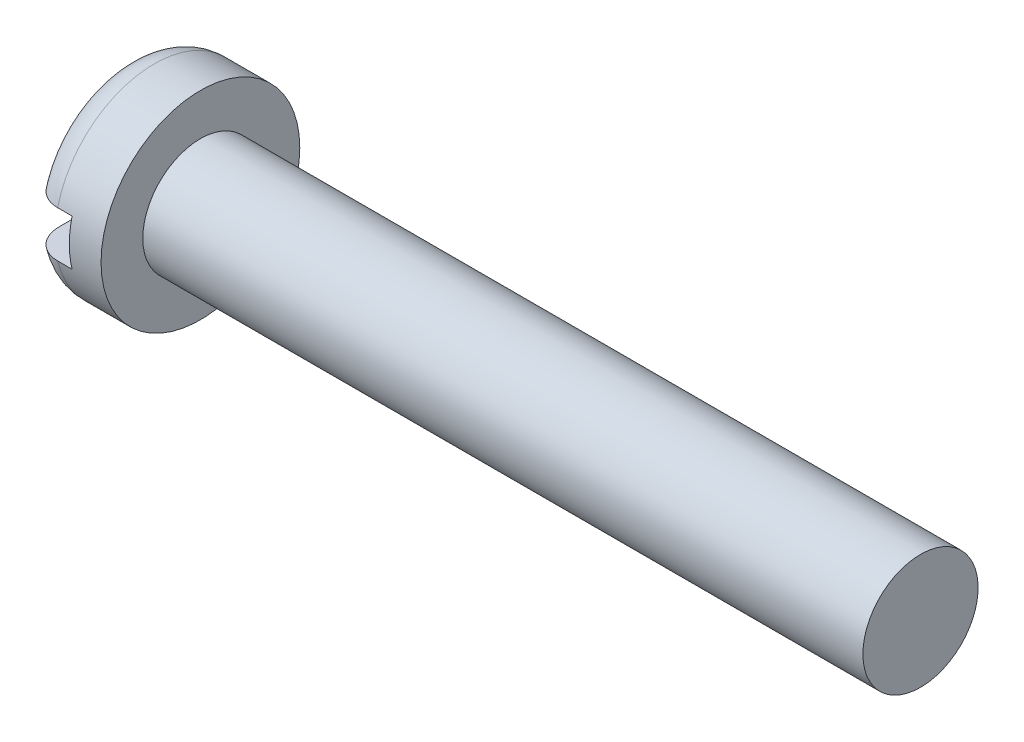
ISO-10303-21;
HEADER;
FILE_DESCRIPTION(('STEP AP214'),'2;1');
FILE_NAME('part.step','',(''),(''),'','','');
FILE_SCHEMA(('AUTOMOTIVE_DESIGN { 1 0 10303 214 1 1 1 1 }'));
ENDSEC;
DATA;
#1=APPLICATION_CONTEXT('core data for automotive mechanical design processes');
#2=APPLICATION_PROTOCOL_DEFINITION('international standard','automotive_design',2000,#1);
#3=PRODUCT_CONTEXT('',#1,'mechanical');
#4=PRODUCT('Part','Part','',(#3));
#5=PRODUCT_RELATED_PRODUCT_CATEGORY('part','',(#4));
#6=PRODUCT_DEFINITION_FORMATION('','',#4);
#7=PRODUCT_DEFINITION_CONTEXT('part definition',#1,'design');
#8=PRODUCT_DEFINITION('design','',#6,#7);
#9=PRODUCT_DEFINITION_SHAPE('','',#8);
#10=(LENGTH_UNIT() NAMED_UNIT(*) SI_UNIT(.MILLI.,.METRE.));
#11=(NAMED_UNIT(*) PLANE_ANGLE_UNIT() SI_UNIT($,.RADIAN.));
#12=(NAMED_UNIT(*) SI_UNIT($,.STERADIAN.) SOLID_ANGLE_UNIT());
#13=UNCERTAINTY_MEASURE_WITH_UNIT(LENGTH_MEASURE(1.E-05),#10,'distance_accuracy_value','');
#14=(GEOMETRIC_REPRESENTATION_CONTEXT(3) GLOBAL_UNCERTAINTY_ASSIGNED_CONTEXT((#13)) GLOBAL_UNIT_ASSIGNED_CONTEXT((#10,
#11,#12)) REPRESENTATION_CONTEXT('',''));
#15=CARTESIAN_POINT('',(0.,0.,0.));
#16=DIRECTION('',(0.,0.,1.));
#17=DIRECTION('',(1.,0.,0.));
#18=AXIS2_PLACEMENT_3D('',#15,#16,#17);
#19=CARTESIAN_POINT('',(0.,0.,0.));
#20=DIRECTION('',(-1.,0.,0.));
#21=DIRECTION('',(0.,0.,1.));
#22=AXIS2_PLACEMENT_3D('',#19,#20,#21);
#23=PLANE('',#22);
#24=DIRECTION('',(0.,0.,-1.));
#25=VECTOR('',#24,1.);
#26=CARTESIAN_POINT('',(0.,0.799999999999999,3.45));
#27=LINE('',#26,#25);
#28=CARTESIAN_POINT('',(0.,0.799999999999999,2.31570723538188));
#29=VERTEX_POINT('',#28);
#30=CARTESIAN_POINT('',(0.,0.799999999999999,-2.31570723538188));
#31=VERTEX_POINT('',#30);
#32=EDGE_CURVE('E191',#29,#31,#27,.T.);
#33=ORIENTED_EDGE('',*,*,#32,.F.);
#34=CARTESIAN_POINT('',(0.,0.,0.));
#35=DIRECTION('',(-1.,0.,0.));
#36=DIRECTION('',(0.,0.,1.));
#37=AXIS2_PLACEMENT_3D('',#34,#35,#36);
#38=CIRCLE('',#37,2.45);
#39=EDGE_CURVE('E108',#29,#31,#38,.T.);
#40=ORIENTED_EDGE('',*,*,#39,.T.);
#41=EDGE_LOOP('',(#33,#40));
#42=FACE_BOUND('',#41,.T.);
#43=ADVANCED_FACE('F32',(#42),#23,.T.);
#44=CARTESIAN_POINT('',(1.,0.,0.));
#45=DIRECTION('',(-1.,0.,0.));
#46=DIRECTION('',(0.,0.,1.));
#47=AXIS2_PLACEMENT_3D('',#44,#45,#46);
#48=TOROIDAL_SURFACE('',#47,2.45,1.);
#49=CARTESIAN_POINT('',(0.379328589562095,0.799999999999999,-3.13356248707986));
#50=CARTESIAN_POINT('',(0.42216324960779,0.799999999999999,-3.16855680472166));
#51=CARTESIAN_POINT('',(0.467921085541035,0.799999999999999,-3.19999606182491));
#52=CARTESIAN_POINT('',(0.564068735088835,0.799999999999999,-3.25478773540702));
#53=CARTESIAN_POINT('',(0.614460287924244,0.799999999999999,-3.27813709961566));
#54=CARTESIAN_POINT('',(0.718487832453669,0.799999999999999,-3.31600908292942));
#55=CARTESIAN_POINT('',(0.772125224869883,0.799999999999999,-3.33052786094909));
#56=CARTESIAN_POINT('',(0.881082475688186,0.799999999999999,-3.35025333735023));
#57=CARTESIAN_POINT('',(0.936402169574521,0.799999999999999,-3.35546094333134));
#58=CARTESIAN_POINT('',(1.04659113389607,0.799999999999999,-3.35639447096481));
#59=CARTESIAN_POINT('',(1.10145966066304,0.799999999999999,-3.35221046648378));
#60=CARTESIAN_POINT('',(1.20971047056224,0.799999999999999,-3.33467925211081));
#61=CARTESIAN_POINT('',(1.26309278448111,0.799999999999999,-3.32133223217636));
#62=CARTESIAN_POINT('',(1.36682394301319,0.799999999999999,-3.28591170963461));
#63=CARTESIAN_POINT('',(1.41717536661802,0.799999999999999,-3.26384575049572));
#64=CARTESIAN_POINT('',(1.51351872065085,0.799999999999999,-3.21167148247726));
#65=CARTESIAN_POINT('',(1.55951050219388,0.799999999999999,-3.18156289907015));
#66=CARTESIAN_POINT('',(1.64645920631654,0.799999999999999,-3.11379971777898));
#67=CARTESIAN_POINT('',(1.6873475732739,0.799999999999999,-3.0760572248481));
#68=CARTESIAN_POINT('',(1.76239453795157,0.799999999999999,-2.9943946044341));
#69=CARTESIAN_POINT('',(1.79655251843696,0.799999999999999,-2.95047391098878));
#70=CARTESIAN_POINT('',(1.85812790428364,0.799999999999999,-2.85653781215608));
#71=CARTESIAN_POINT('',(1.88535255375914,0.799999999999999,-2.80639616146867));
#72=CARTESIAN_POINT('',(1.93134428825464,0.799999999999999,-2.70237970857351));
#73=CARTESIAN_POINT('',(1.95011007040464,0.799999999999999,-2.64850433275524));
#74=CARTESIAN_POINT('',(1.97944609979859,0.799999999999999,-2.5363711092309));
#75=CARTESIAN_POINT('',(1.98967655604326,0.799999999999999,-2.47802448677962));
#76=CARTESIAN_POINT('',(2.00068051693129,0.799999999999999,-2.36045111588208));
#77=CARTESIAN_POINT('',(2.00145193799159,0.799999999999999,-2.30122417640104));
#78=CARTESIAN_POINT('',(1.99355893176028,0.799999999999999,-2.18053140561759));
#79=CARTESIAN_POINT('',(1.98443719354087,0.799999999999999,-2.11909551786252));
#80=CARTESIAN_POINT('',(1.95649088890605,0.799999999999999,-1.99847417027895));
#81=CARTESIAN_POINT('',(1.9376641502528,0.799999999999999,-1.93928921745559));
#82=CARTESIAN_POINT('',(1.88981295630175,0.799999999999999,-1.82192856568864));
#83=CARTESIAN_POINT('',(1.8603510042588,0.799999999999999,-1.76393087932894));
#84=CARTESIAN_POINT('',(1.79221823426723,0.799999999999999,-1.65356232849833));
#85=CARTESIAN_POINT('',(1.75354120166833,0.799999999999999,-1.60119529607969));
#86=CARTESIAN_POINT('',(1.66730460036131,0.799999999999999,-1.50318951482896));
#87=CARTESIAN_POINT('',(1.6196425689982,0.799999999999999,-1.45764049655154));
#88=CARTESIAN_POINT('',(1.51676362996248,0.799999999999999,-1.37607953503427));
#89=CARTESIAN_POINT('',(1.46155776699471,0.799999999999999,-1.34005387111982));
#90=CARTESIAN_POINT('',(1.35888732970495,0.799999999999999,-1.28703254146953));
#91=CARTESIAN_POINT('',(1.31270391560194,0.799999999999999,-1.26754873005201));
#92=CARTESIAN_POINT('',(1.21774303334109,0.799999999999999,-1.23656018278569));
#93=CARTESIAN_POINT('',(1.16896843221444,0.799999999999999,-1.22504681813173));
#94=CARTESIAN_POINT('',(1.06994567718465,0.799999999999999,-1.21078330575391));
#95=CARTESIAN_POINT('',(1.01969260808161,0.799999999999999,-1.20806678518099));
#96=CARTESIAN_POINT('',(0.919513490669943,0.799999999999999,-1.21171856588185));
#97=CARTESIAN_POINT('',(0.869587488348321,0.799999999999999,-1.21808811827695));
#98=CARTESIAN_POINT('',(0.77449815262065,0.799999999999999,-1.23877248185216));
#99=CARTESIAN_POINT('',(0.729226934121978,0.799999999999999,-1.25260173589294));
#100=CARTESIAN_POINT('',(0.64135211056884,0.799999999999999,-1.28703407976989));
#101=CARTESIAN_POINT('',(0.598749362575584,0.799999999999999,-1.30763933277965));
#102=CARTESIAN_POINT('',(0.513214674264477,0.799999999999999,-1.35683304236042));
#103=CARTESIAN_POINT('',(0.47060298426847,0.799999999999999,-1.38597585818542));
#104=CARTESIAN_POINT('',(0.390031559086151,0.799999999999999,-1.45009504787992));
#105=CARTESIAN_POINT('',(0.352074165186173,0.799999999999999,-1.48507433699938));
#106=CARTESIAN_POINT('',(0.275861298540676,0.799999999999999,-1.56565048078707));
#107=CARTESIAN_POINT('',(0.238455542021653,0.799999999999999,-1.612052928849));
#108=CARTESIAN_POINT('',(0.171148936165514,0.799999999999999,-1.71002155397955));
#109=CARTESIAN_POINT('',(0.14125181466106,0.799999999999999,-1.76159027826095));
#110=CARTESIAN_POINT('',(0.0871588933086179,0.799999999999999,-1.87371495190439));
#111=CARTESIAN_POINT('',(0.0637645765654282,0.799999999999999,-1.93465995167718));
#112=CARTESIAN_POINT('',(0.0274753400471483,0.799999999999999,-2.05960853650317));
#113=CARTESIAN_POINT('',(0.0145812367993428,0.799999999999999,-2.12361235900972));
#114=CARTESIAN_POINT('',(-0.000139920877516413,0.799999999999999,-2.25319462705564));
#115=CARTESIAN_POINT('',(-0.00191611196194109,0.799999999999999,-2.31877893346939));
#116=CARTESIAN_POINT('',(0.00610190413474506,0.799999999999999,-2.44925387804717));
#117=CARTESIAN_POINT('',(0.0158950549608111,0.799999999999999,-2.51414457899598));
#118=CARTESIAN_POINT('',(0.0463672287137823,0.799999999999999,-2.6383027763323));
#119=CARTESIAN_POINT('',(0.066549768771832,0.799999999999999,-2.69769207512649));
#120=CARTESIAN_POINT('',(0.117125301866721,0.799999999999999,-2.8119244703886));
#121=CARTESIAN_POINT('',(0.147508585101434,0.799999999999999,-2.86677182854091));
#122=CARTESIAN_POINT('',(0.210006873138939,0.799999999999999,-2.95873579835869));
#123=CARTESIAN_POINT('',(0.240292532419979,0.799999999999999,-2.99710787639285));
#124=CARTESIAN_POINT('',(0.306071544450911,0.799999999999999,-3.06909468248337));
#125=CARTESIAN_POINT('',(0.34156400029591,0.799999999999999,-3.10271022792844));
#126=CARTESIAN_POINT('',(0.379328589562095,0.799999999999999,-3.13356248707986));
#127=B_SPLINE_CURVE_WITH_KNOTS('',3,(#49,#50,#51,#52,#53,#54,#55,#56,#57,#58,#59,#60,#61,#62,
#63,#64,#65,#66,#67,#68,#69,#70,#71,#72,#73,#74,#75,#76,#77,#78,#79,#80,#81,#82,#83,#84,#85,#86,
#87,#88,#89,#90,#91,#92,#93,#94,#95,#96,#97,#98,#99,#100,#101,#102,#103,#104,#105,#106,#107,
#108,#109,#110,#111,#112,#113,#114,#115,#116,#117,#118,#119,#120,#121,#122,#123,#124,#125,#126),
.UNSPECIFIED.,.T.,.F.,(4,2,2,2,2,2,2,2,2,2,2,2,2,2,2,2,2,2,2,2,2,2,2,2,2,2,2,2,2,2,2,2,2,2,2,2,
2,2,4),(0.,0.165765489478357,0.331593453392818,0.497493496859305,0.663377368459352,
0.827677071576171,0.991973368716078,1.15612782982862,1.32028789491814,1.486458306905,
1.65264395107656,1.82304106000352,1.99346440524281,2.17038620048743,2.34734696637007,
2.53285046802217,2.7183955083436,2.9126565938619,3.10704906174605,3.30380950398147,
3.50028490126433,3.65003620847826,3.79962514033556,3.9497852256682,4.09996598952962,
4.24137913009253,4.38283745936037,4.53711911675799,4.69147806799737,4.86954619904787,
5.04770256208482,5.24262745545655,5.43756750531053,5.63339873862761,5.82921209268021,
6.01643391472204,6.20347802843949,6.34964804303276,6.495792908382),.UNSPECIFIED.);
#128=CARTESIAN_POINT('',(1.,0.799999999999999,-3.35596483890997));
#129=VERTEX_POINT('',#128);
#130=EDGE_CURVE('E54',#31,#129,#127,.T.);
#131=ORIENTED_EDGE('',*,*,#130,.F.);
#132=ORIENTED_EDGE('',*,*,#39,.F.);
#133=CARTESIAN_POINT('',(0.950233505543644,0.799999999999999,1.21082409231496));
#134=CARTESIAN_POINT('',(0.999901314950636,0.799999999999999,1.20786305756211));
#135=CARTESIAN_POINT('',(1.04987824434808,0.799999999999999,1.2093586789418));
#136=CARTESIAN_POINT('',(1.14880764745011,0.799999999999999,1.22117214786542));
#137=CARTESIAN_POINT('',(1.19775867448827,0.799999999999999,1.231501693833));
#138=CARTESIAN_POINT('',(1.29297995965792,0.799999999999999,1.26015516016196));
#139=CARTESIAN_POINT('',(1.33926177591377,0.799999999999999,1.27844113356005));
#140=CARTESIAN_POINT('',(1.42841421197942,0.799999999999999,1.32194820657372));
#141=CARTESIAN_POINT('',(1.47128400244018,0.799999999999999,1.34717098569645));
#142=CARTESIAN_POINT('',(1.55611041572956,0.799999999999999,1.40568105316454));
#143=CARTESIAN_POINT('',(1.59773936804486,0.799999999999999,1.43944152385043));
#144=CARTESIAN_POINT('',(1.67566738740522,0.799999999999999,1.51262595568974));
#145=CARTESIAN_POINT('',(1.71196423152633,0.799999999999999,1.55205226542392));
#146=CARTESIAN_POINT('',(1.78371589769894,0.799999999999999,1.64181259231406));
#147=CARTESIAN_POINT('',(1.81823618304841,0.799999999999999,1.69289631704307));
#148=CARTESIAN_POINT('',(1.87886723665165,0.799999999999999,1.79984411915148));
#149=CARTESIAN_POINT('',(1.9049742144087,0.799999999999999,1.85571033690965));
#150=CARTESIAN_POINT('',(1.94956891092814,0.799999999999999,1.9747671239623));
#151=CARTESIAN_POINT('',(1.96742096153191,0.799999999999999,2.03819749670857));
#152=CARTESIAN_POINT('',(1.99206205858004,0.799999999999999,2.1671809246667));
#153=CARTESIAN_POINT('',(1.99885141256574,0.799999999999999,2.23273392081827));
#154=CARTESIAN_POINT('',(2.00086625241663,0.799999999999999,2.36310011941472));
#155=CARTESIAN_POINT('',(1.99625464664842,0.799999999999999,2.42791060187121));
#156=CARTESIAN_POINT('',(1.97563300102092,0.799999999999999,2.55569967532251));
#157=CARTESIAN_POINT('',(1.9596259094081,0.799999999999999,2.61867873575811));
#158=CARTESIAN_POINT('',(1.91750016664232,0.799999999999999,2.7376807746383));
#159=CARTESIAN_POINT('',(1.89191790310337,0.799999999999999,2.79389355251038));
#160=CARTESIAN_POINT('',(1.83120883944759,0.799999999999999,2.90090889450871));
#161=CARTESIAN_POINT('',(1.79608483832818,0.799999999999999,2.95171303914353));
#162=CARTESIAN_POINT('',(1.7191774898602,0.799999999999999,3.04383586072857));
#163=CARTESIAN_POINT('',(1.67780417240582,0.799999999999999,3.0854970721009));
#164=CARTESIAN_POINT('',(1.58842106942357,0.799999999999999,3.16096141536488));
#165=CARTESIAN_POINT('',(1.54041277025886,0.799999999999999,3.19476630268822));
#166=CARTESIAN_POINT('',(1.44101524958936,0.799999999999999,3.2523028967594));
#167=CARTESIAN_POINT('',(1.38981120741904,0.799999999999999,3.27635481760217));
#168=CARTESIAN_POINT('',(1.28403254024917,0.799999999999999,3.31530458741997));
#169=CARTESIAN_POINT('',(1.22945838695094,0.799999999999999,3.33020371429431));
#170=CARTESIAN_POINT('',(1.11975629411733,0.799999999999999,3.35013772682032));
#171=CARTESIAN_POINT('',(1.06466564477981,0.799999999999999,3.35537830490496));
#172=CARTESIAN_POINT('',(0.954393893567213,0.799999999999999,3.35645800959652));
#173=CARTESIAN_POINT('',(0.899212797714537,0.799999999999999,3.35229773862604));
#174=CARTESIAN_POINT('',(0.790765288563437,0.799999999999999,3.33477762522099));
#175=CARTESIAN_POINT('',(0.737487505604657,0.799999999999999,3.32148798575134));
#176=CARTESIAN_POINT('',(0.633901358630035,0.799999999999999,3.28620122173498));
#177=CARTESIAN_POINT('',(0.583593000476652,0.799999999999999,3.26420407999794));
#178=CARTESIAN_POINT('',(0.487045140218185,0.799999999999999,3.21203398802016));
#179=CARTESIAN_POINT('',(0.440830353056087,0.799999999999999,3.18181534171131));
#180=CARTESIAN_POINT('',(0.354013080734486,0.799999999999999,3.11418095298906));
#181=CARTESIAN_POINT('',(0.313410959634569,0.799999999999999,3.07676474408957));
#182=CARTESIAN_POINT('',(0.238125775339669,0.799999999999999,2.99507777500061));
#183=CARTESIAN_POINT('',(0.203568069299999,0.799999999999999,2.95069157240052));
#184=CARTESIAN_POINT('',(0.1421299477148,0.799999999999999,2.85689725717983));
#185=CARTESIAN_POINT('',(0.11525044260639,0.799999999999999,2.80748854996038));
#186=CARTESIAN_POINT('',(0.0689840845975533,0.799999999999999,2.70339255512364));
#187=CARTESIAN_POINT('',(0.0498628329305354,0.799999999999999,2.64858733714804));
#188=CARTESIAN_POINT('',(0.0206693813275202,0.799999999999999,2.53662293773873));
#189=CARTESIAN_POINT('',(0.0105989432620323,0.799999999999999,2.47946330024741));
#190=CARTESIAN_POINT('',(-0.00069953729083651,0.799999999999999,2.36175036962064));
#191=CARTESIAN_POINT('',(-0.00152074357481851,0.799999999999999,2.30115812819215));
#192=CARTESIAN_POINT('',(0.00650996510216422,0.799999999999999,2.1806228761101));
#193=CARTESIAN_POINT('',(0.0153640404941239,0.799999999999999,2.12068001347779));
#194=CARTESIAN_POINT('',(0.0429967206233654,0.799999999999999,1.99995962747682));
#195=CARTESIAN_POINT('',(0.0622502455952226,0.799999999999999,1.93929070195133));
#196=CARTESIAN_POINT('',(0.110306434824482,0.799999999999999,1.82184929217392));
#197=CARTESIAN_POINT('',(0.139112111937843,0.799999999999999,1.76507804412122));
#198=CARTESIAN_POINT('',(0.206724671774443,0.799999999999999,1.65499871478988));
#199=CARTESIAN_POINT('',(0.245852173929219,0.799999999999999,1.6018868964422));
#200=CARTESIAN_POINT('',(0.332732082248245,0.799999999999999,1.50314563953895));
#201=CARTESIAN_POINT('',(0.380490466000798,0.799999999999999,1.45752142881329));
#202=CARTESIAN_POINT('',(0.482142814851046,0.799999999999999,1.37695974759133));
#203=CARTESIAN_POINT('',(0.535824281381173,0.799999999999999,1.34175582122289));
#204=CARTESIAN_POINT('',(0.648993119007128,0.799999999999999,1.28264002496781));
#205=CARTESIAN_POINT('',(0.708458819641164,0.799999999999999,1.25868782892961));
#206=CARTESIAN_POINT('',(0.799170569601131,0.799999999999999,1.23314129702258));
#207=CARTESIAN_POINT('',(0.829026024082726,0.799999999999999,1.22639643463015));
#208=CARTESIAN_POINT('',(0.889293226493369,0.799999999999999,1.21614784200085));
#209=CARTESIAN_POINT('',(0.919704973267781,0.799999999999999,1.21264410503752));
#210=CARTESIAN_POINT('',(0.950233505543644,0.799999999999999,1.21082409231496));
#211=B_SPLINE_CURVE_WITH_KNOTS('',3,(#133,#134,#135,#136,#137,#138,#139,#140,#141,#142,#143,
#144,#145,#146,#147,#148,#149,#150,#151,#152,#153,#154,#155,#156,#157,#158,#159,#160,#161,#162,
#163,#164,#165,#166,#167,#168,#169,#170,#171,#172,#173,#174,#175,#176,#177,#178,#179,#180,#181,
#182,#183,#184,#185,#186,#187,#188,#189,#190,#191,#192,#193,#194,#195,#196,#197,#198,#199,#200,
#201,#202,#203,#204,#205,#206,#207,#208,#209,#210),.UNSPECIFIED.,.T.,.F.,(4,2,2,2,2,2,2,2,2,2,2,
2,2,2,2,2,2,2,2,2,2,2,2,2,2,2,2,2,2,2,2,2,2,2,2,2,2,2,4),(0.,0.149142686358929,
0.298483182962698,0.447119098963346,0.595791033730436,0.755973498316927,0.916222553647615,
1.1003933403799,1.28464698702654,1.48137771881206,1.67810298141907,1.87203352656266,
2.0659139161128,2.25025287753155,2.43453782277558,2.60980395102952,2.78503087976001,
2.95391771310213,3.12278096135646,3.28800452496372,3.45321750106086,3.61717403942373,
3.78113090147095,3.94601835909414,4.11091650695258,4.27890872490592,4.44692085415414,
4.62027856721824,4.7936700195396,4.97465993550509,5.15569027366736,5.34578873207963,
5.53594720680008,5.7329012559948,5.92999223834139,6.12149189523972,6.31229988082678,
6.40397126351722,6.49564245595713),.UNSPECIFIED.);
#212=CARTESIAN_POINT('',(1.,0.799999999999999,3.35596483890997));
#213=VERTEX_POINT('',#212);
#214=EDGE_CURVE('E134',#213,#29,#211,.T.);
#215=ORIENTED_EDGE('',*,*,#214,.F.);
#216=CARTESIAN_POINT('',(1.,0.,0.));
#217=DIRECTION('',(-1.,0.,0.));
#218=DIRECTION('',(0.,0.,1.));
#219=AXIS2_PLACEMENT_3D('',#216,#217,#218);
#220=CIRCLE('',#219,3.45);
#221=EDGE_CURVE('E102',#213,#129,#220,.T.);
#222=ORIENTED_EDGE('',*,*,#221,.T.);
#223=EDGE_LOOP('',(#131,#132,#215,#222));
#224=FACE_BOUND('',#223,.T.);
#225=ADVANCED_FACE('F176',(#224),#48,.T.);
#226=CARTESIAN_POINT('',(-25.4,0.,0.));
#227=DIRECTION('',(-1.,0.,0.));
#228=DIRECTION('',(0.,0.,1.));
#229=AXIS2_PLACEMENT_3D('',#226,#227,#228);
#230=CYLINDRICAL_SURFACE('',#229,2.);
#231=CARTESIAN_POINT('',(27.6,0.,0.));
#232=DIRECTION('',(-1.,0.,0.));
#233=DIRECTION('',(0.,0.,1.));
#234=AXIS2_PLACEMENT_3D('',#231,#232,#233);
#235=CIRCLE('',#234,2.);
#236=CARTESIAN_POINT('',(27.6,0.,2.));
#237=VERTEX_POINT('',#236);
#238=EDGE_CURVE('E116',#237,#237,#235,.T.);
#239=ORIENTED_EDGE('',*,*,#238,.T.);
#240=EDGE_LOOP('',(#239));
#241=FACE_BOUND('',#240,.T.);
#242=CARTESIAN_POINT('',(2.6,0.,0.));
#243=DIRECTION('',(-1.,0.,0.));
#244=DIRECTION('',(0.,0.,1.));
#245=AXIS2_PLACEMENT_3D('',#242,#243,#244);
#246=CIRCLE('',#245,2.);
#247=CARTESIAN_POINT('',(2.6,0.,2.));
#248=VERTEX_POINT('',#247);
#249=EDGE_CURVE('E164',#248,#248,#246,.T.);
#250=ORIENTED_EDGE('',*,*,#249,.F.);
#251=EDGE_LOOP('',(#250));
#252=FACE_BOUND('',#251,.T.);
#253=ADVANCED_FACE('F34',(#241,#252),#230,.T.);
#254=CARTESIAN_POINT('',(27.6,2.,0.));
#255=DIRECTION('',(1.,0.,0.));
#256=DIRECTION('',(0.,0.,-1.));
#257=AXIS2_PLACEMENT_3D('',#254,#255,#256);
#258=PLANE('',#257);
#259=ORIENTED_EDGE('',*,*,#238,.F.);
#260=EDGE_LOOP('',(#259));
#261=FACE_BOUND('',#260,.T.);
#262=ADVANCED_FACE('F184',(#261),#258,.T.);
#263=DIRECTION('',(0.,0.,1.));
#264=VECTOR('',#263,1.);
#265=CARTESIAN_POINT('',(0.,-0.8,-3.45));
#266=LINE('',#265,#264);
#267=CARTESIAN_POINT('',(0.,-0.8,-2.31570723538188));
#268=VERTEX_POINT('',#267);
#269=CARTESIAN_POINT('',(0.,-0.8,2.31570723538188));
#270=VERTEX_POINT('',#269);
#271=EDGE_CURVE('E96',#268,#270,#266,.T.);
#272=ORIENTED_EDGE('',*,*,#271,.F.);
#273=EDGE_CURVE('E104',#268,#270,#38,.T.);
#274=ORIENTED_EDGE('',*,*,#273,.T.);
#275=EDGE_LOOP('',(#272,#274));
#276=FACE_BOUND('',#275,.T.);
#277=ADVANCED_FACE('F178',(#276),#23,.T.);
#278=CARTESIAN_POINT('',(0.379328589562095,-0.8,-3.13356248707986));
#279=CARTESIAN_POINT('',(0.334713816091988,-0.8,-3.09710916791241));
#280=CARTESIAN_POINT('',(0.293233096406716,-0.8,-3.05676770225712));
#281=CARTESIAN_POINT('',(0.217692053331874,-0.8,-2.9696108395322));
#282=CARTESIAN_POINT('',(0.183639619775848,-0.8,-2.92278864447759));
#283=CARTESIAN_POINT('',(0.123866705436374,-0.8,-2.82422532720656));
#284=CARTESIAN_POINT('',(0.0981306975683999,-0.8,-2.77249360773282));
#285=CARTESIAN_POINT('',(0.0554279081805355,-0.8,-2.66555282631215));
#286=CARTESIAN_POINT('',(0.0384599083023377,-0.8,-2.61034424868868));
#287=CARTESIAN_POINT('',(0.0131355135841197,-0.8,-2.4962214414734));
#288=CARTESIAN_POINT('',(0.00505775471622187,-0.8,-2.43724554037945));
#289=CARTESIAN_POINT('',(-0.00157786246153982,-0.8,-2.31876333702174));
#290=CARTESIAN_POINT('',(-0.000133344864085279,-0.8,-2.2592569060842));
#291=CARTESIAN_POINT('',(0.0123150136839031,-0.8,-2.13829391531904));
#292=CARTESIAN_POINT('',(0.023785548247956,-0.8,-2.07688539954483));
#293=CARTESIAN_POINT('',(0.0564098626909815,-0.8,-1.95669722390086));
#294=CARTESIAN_POINT('',(0.0775659478743232,-0.8,-1.89791819354575));
#295=CARTESIAN_POINT('',(0.130085377459132,-0.8,-1.78187727759876));
#296=CARTESIAN_POINT('',(0.161867251843858,-0.8,-1.72480437174009));
#297=CARTESIAN_POINT('',(0.234528164215489,-0.8,-1.61670729137654));
#298=CARTESIAN_POINT('',(0.27541339798063,-0.8,-1.56568727291231));
#299=CARTESIAN_POINT('',(0.365594176967962,-0.8,-1.47125702935851));
#300=CARTESIAN_POINT('',(0.414924493984135,-0.8,-1.4278798345364));
#301=CARTESIAN_POINT('',(0.52081085711068,-0.8,-1.35110939433871));
#302=CARTESIAN_POINT('',(0.577354530386477,-0.8,-1.31769937275226));
#303=CARTESIAN_POINT('',(0.681446956259837,-0.8,-1.26994322117587));
#304=CARTESIAN_POINT('',(0.727775803994662,-0.8,-1.25292771358647));
#305=CARTESIAN_POINT('',(0.822618254645794,-0.8,-1.22689715132337));
#306=CARTESIAN_POINT('',(0.871129497044894,-0.8,-1.21787366103029));
#307=CARTESIAN_POINT('',(0.969135476116513,-0.8,-1.20846043440244));
#308=CARTESIAN_POINT('',(1.01863265395119,-0.8,-1.20809577484242));
#309=CARTESIAN_POINT('',(1.11692192830049,-0.8,-1.21609391125395));
#310=CARTESIAN_POINT('',(1.16571380793435,-0.8,-1.22445933620345));
#311=CARTESIAN_POINT('',(1.25923880494797,-0.8,-1.24878795622466));
#312=CARTESIAN_POINT('',(1.30405622691371,-0.8,-1.26443268064343));
#313=CARTESIAN_POINT('',(1.39080311521273,-0.8,-1.30230299785749));
#314=CARTESIAN_POINT('',(1.43273164877648,-0.8,-1.32453070401751));
#315=CARTESIAN_POINT('',(1.51732941481453,-0.8,-1.37731032658216));
#316=CARTESIAN_POINT('',(1.55960138874394,-0.8,-1.40849691278058));
#317=CARTESIAN_POINT('',(1.6391938360005,-0.8,-1.47664465172937));
#318=CARTESIAN_POINT('',(1.67651168297986,-0.8,-1.51360884495277));
#319=CARTESIAN_POINT('',(1.75094075838248,-0.8,-1.59829150329676));
#320=CARTESIAN_POINT('',(1.78716605359001,-0.8,-1.64679090174184));
#321=CARTESIAN_POINT('',(1.85171331557454,-0.8,-1.74879919375196));
#322=CARTESIAN_POINT('',(1.88003166165355,-0.8,-1.80231036734757));
#323=CARTESIAN_POINT('',(1.93010531217315,-0.8,-1.91764878548849));
#324=CARTESIAN_POINT('',(1.95112432080383,-0.8,-1.97979779755695));
#325=CARTESIAN_POINT('',(1.98239203974677,-0.8,-2.10675854914739));
#326=CARTESIAN_POINT('',(1.99264026899177,-0.8,-2.17157040746868));
#327=CARTESIAN_POINT('',(2.00178962673757,-0.8,-2.30173446578643));
#328=CARTESIAN_POINT('',(2.00073798173744,-0.8,-2.36708327716885));
#329=CARTESIAN_POINT('',(1.98711662629678,-0.8,-2.49657712429248));
#330=CARTESIAN_POINT('',(1.97454967987937,-0.8,-2.56072244513777));
#331=CARTESIAN_POINT('',(1.93885067021882,-0.8,-2.68275475588596));
#332=CARTESIAN_POINT('',(1.91624000733488,-0.8,-2.74079412949233));
#333=CARTESIAN_POINT('',(1.86109030675058,-0.8,-2.85195189595674));
#334=CARTESIAN_POINT('',(1.82855420576118,-0.8,-2.90507173833985));
#335=CARTESIAN_POINT('',(1.75627361530226,-0.8,-3.00204673990428));
#336=CARTESIAN_POINT('',(1.71697350741279,-0.8,-3.04623332013203));
#337=CARTESIAN_POINT('',(1.63124838529853,-0.8,-3.12705168794003));
#338=CARTESIAN_POINT('',(1.58482506146044,-0.8,-3.16368526307753));
#339=CARTESIAN_POINT('',(1.48811762626813,-0.8,-3.22690286435155));
#340=CARTESIAN_POINT('',(1.4380503569685,-0.8,-3.25381890515169));
#341=CARTESIAN_POINT('',(1.3340296991122,-0.8,-3.2986264543168));
#342=CARTESIAN_POINT('',(1.28007699521132,-0.8,-3.31651954819798));
#343=CARTESIAN_POINT('',(1.17120700349762,-0.8,-3.34237455440643));
#344=CARTESIAN_POINT('',(1.11634349913061,-0.8,-3.35056337465957));
#345=CARTESIAN_POINT('',(1.00601391490005,-0.8,-3.35751492704766));
#346=CARTESIAN_POINT('',(0.950547781532651,-0.8,-3.35627681527829));
#347=CARTESIAN_POINT('',(0.841152106206806,-0.8,-3.34447084163231));
#348=CARTESIAN_POINT('',(0.787213023391106,-0.8,-3.33399074877826));
#349=CARTESIAN_POINT('',(0.681884120112023,-0.8,-3.30415486375491));
#350=CARTESIAN_POINT('',(0.630492208404358,-0.8,-3.2848064908895));
#351=CARTESIAN_POINT('',(0.545038341611738,-0.8,-3.24421827887769));
#352=CARTESIAN_POINT('',(0.510046823961508,-0.8,-3.22490324609263));
#353=CARTESIAN_POINT('',(0.442645037875833,-0.8,-3.18220164741545));
#354=CARTESIAN_POINT('',(0.410234825071011,-0.8,-3.15881499380896));
#355=CARTESIAN_POINT('',(0.379328589562095,-0.8,-3.13356248707986));
#356=B_SPLINE_CURVE_WITH_KNOTS('',3,(#278,#279,#280,#281,#282,#283,#284,#285,#286,#287,#288,
#289,#290,#291,#292,#293,#294,#295,#296,#297,#298,#299,#300,#301,#302,#303,#304,#305,#306,#307,
#308,#309,#310,#311,#312,#313,#314,#315,#316,#317,#318,#319,#320,#321,#322,#323,#324,#325,#326,
#327,#328,#329,#330,#331,#332,#333,#334,#335,#336,#337,#338,#339,#340,#341,#342,#343,#344,#345,
#346,#347,#348,#349,#350,#351,#352,#353,#354,#355),.UNSPECIFIED.,.T.,.F.,(4,2,2,2,2,2,2,2,2,2,2,
2,2,2,2,2,2,2,2,2,2,2,2,2,2,2,2,2,2,2,2,2,2,2,2,2,2,2,4),(0.,0.172690524437173,
0.345563585757204,0.518111996183851,0.690636423699071,0.868426378945762,1.04626069631984,
1.23284203668028,1.41946780926723,1.61453772090127,1.80974080584869,2.00576785064243,
2.20146306719746,2.34890457414573,2.4961902696467,2.64390246628345,2.7916591578155,
2.93348458085163,3.07535558419827,3.23234587658139,3.38941906520356,3.57026293483607,
3.75118947999638,3.94707631593406,4.14297190061089,4.33804908220646,4.53307945159837,
4.71899189704092,4.90484938849138,5.08136746347647,5.25784371414338,5.42754009658276,
5.59720664949865,5.76282240768085,5.92845299205424,6.09252735778114,6.25646470687492,
6.37609097890716,6.49571982835071),.UNSPECIFIED.);
#357=CARTESIAN_POINT('',(1.,-0.8,-3.35596483890997));
#358=VERTEX_POINT('',#357);
#359=EDGE_CURVE('E131',#358,#268,#356,.T.);
#360=ORIENTED_EDGE('',*,*,#359,.F.);
#361=CARTESIAN_POINT('',(1.,-0.8,3.35596483890997));
#362=VERTEX_POINT('',#361);
#363=EDGE_CURVE('E105',#358,#362,#220,.T.);
#364=ORIENTED_EDGE('',*,*,#363,.T.);
#365=CARTESIAN_POINT('',(0.950233505543644,-0.8,1.21082409231496));
#366=CARTESIAN_POINT('',(0.898691670587007,-0.8,1.21390747401225));
#367=CARTESIAN_POINT('',(0.847401905351659,-0.8,1.2217953920837));
#368=CARTESIAN_POINT('',(0.747013019851427,-0.8,1.24655524855633));
#369=CARTESIAN_POINT('',(0.697917409129123,-0.8,1.26344105822738));
#370=CARTESIAN_POINT('',(0.603493242615596,-0.8,1.30492795461297));
#371=CARTESIAN_POINT('',(0.558143837808931,-0.8,1.32948210657318));
#372=CARTESIAN_POINT('',(0.471698991056932,-0.8,1.38513978734416));
#373=CARTESIAN_POINT('',(0.430603878166465,-0.8,1.41624382220217));
#374=CARTESIAN_POINT('',(0.349274564554271,-0.8,1.4873925328615));
#375=CARTESIAN_POINT('',(0.309555768935933,-0.8,1.52802555847098));
#376=CARTESIAN_POINT('',(0.236568591250241,-0.8,1.61472183375887));
#377=CARTESIAN_POINT('',(0.203303192268079,-0.8,1.66078757896939));
#378=CARTESIAN_POINT('',(0.140059545085091,-0.8,1.76329929318667));
#379=CARTESIAN_POINT('',(0.111012912427254,-0.8,1.82032291960454));
#380=CARTESIAN_POINT('',(0.0625585997671099,-0.8,1.93834119454462));
#381=CARTESIAN_POINT('',(0.0431536488225491,-0.8,1.99933696185359));
#382=CARTESIAN_POINT('',(0.0142128482092254,-0.8,2.12564471414503));
#383=CARTESIAN_POINT('',(0.00500225604824225,-0.8,2.19103191692586));
#384=CARTESIAN_POINT('',(-0.00190059180866933,-0.8,2.32241971174398));
#385=CARTESIAN_POINT('',(0.000405340813098028,-0.8,2.38842020567305));
#386=CARTESIAN_POINT('',(0.0165022605520302,-0.8,2.51674187051462));
#387=CARTESIAN_POINT('',(0.0299012667313352,-0.8,2.57911192289772));
#388=CARTESIAN_POINT('',(0.0675588851571875,-0.8,2.70048908131373));
#389=CARTESIAN_POINT('',(0.0918143477800688,-0.8,2.75949715711423));
#390=CARTESIAN_POINT('',(0.149122644240184,-0.8,2.86920043478792));
#391=CARTESIAN_POINT('',(0.181654270056595,-0.8,2.92016799248297));
#392=CARTESIAN_POINT('',(0.255185711820038,-0.8,3.01558039709644));
#393=CARTESIAN_POINT('',(0.296183224171363,-0.8,3.06002701276907));
#394=CARTESIAN_POINT('',(0.383482862546093,-0.8,3.13905985472103));
#395=CARTESIAN_POINT('',(0.429467576914166,-0.8,3.17399696567901));
#396=CARTESIAN_POINT('',(0.526799699731489,-0.8,3.2353677637692));
#397=CARTESIAN_POINT('',(0.578146088712331,-0.8,3.2618030635493));
#398=CARTESIAN_POINT('',(0.683051584920925,-0.8,3.30461714971714));
#399=CARTESIAN_POINT('',(0.73649613172815,-0.8,3.3212769725388));
#400=CARTESIAN_POINT('',(0.845444470851729,-0.8,3.34522499485975));
#401=CARTESIAN_POINT('',(0.900948039092332,-0.8,3.35251421106751));
#402=CARTESIAN_POINT('',(1.01149252157675,-0.8,3.35744433472942));
#403=CARTESIAN_POINT('',(1.0665267257692,-0.8,3.35523705589374));
#404=CARTESIAN_POINT('',(1.17543597616234,-0.8,3.34158963619138));
#405=CARTESIAN_POINT('',(1.22931106519661,-0.8,3.33014983710424));
#406=CARTESIAN_POINT('',(1.33425666764364,-0.8,3.29843662051946));
#407=CARTESIAN_POINT('',(1.38533332697292,-0.8,3.27818351272223));
#408=CARTESIAN_POINT('',(1.48341096912675,-0.8,3.22947812085862));
#409=CARTESIAN_POINT('',(1.53041184124972,-0.8,3.20102561418084));
#410=CARTESIAN_POINT('',(1.61957649275799,-0.8,3.13643565724587));
#411=CARTESIAN_POINT('',(1.66168220569349,-0.8,3.10021811339729));
#412=CARTESIAN_POINT('',(1.73938696375006,-0.8,3.02137700963747));
#413=CARTESIAN_POINT('',(1.77498544286394,-0.8,2.9787528930617));
#414=CARTESIAN_POINT('',(1.83960986357006,-0.8,2.88724423283625));
#415=CARTESIAN_POINT('',(1.86845794866054,-0.8,2.83823418859295));
#416=CARTESIAN_POINT('',(1.91784624291397,-0.8,2.73619945154953));
#417=CARTESIAN_POINT('',(1.93838524844731,-0.8,2.68317417843459));
#418=CARTESIAN_POINT('',(1.97141193639155,-0.8,2.57254472114949));
#419=CARTESIAN_POINT('',(1.98357525054164,-0.8,2.51484382331279));
#420=CARTESIAN_POINT('',(1.99851527916887,-0.8,2.39824414444596));
#421=CARTESIAN_POINT('',(2.00128992726731,-0.8,2.3393451025821));
#422=CARTESIAN_POINT('',(1.99752251141111,-0.8,2.2190462559132));
#423=CARTESIAN_POINT('',(1.99053162159668,-0.8,2.15766056285365));
#424=CARTESIAN_POINT('',(1.96683772126473,-0.8,2.03679747149752));
#425=CARTESIAN_POINT('',(1.9501327161161,-0.8,1.97732046776573));
#426=CARTESIAN_POINT('',(1.90655512344207,-0.8,1.85894189111964));
#427=CARTESIAN_POINT('',(1.87923152180768,-0.8,1.80020604639657));
#428=CARTESIAN_POINT('',(1.81528482933007,-0.8,1.68798268866529));
#429=CARTESIAN_POINT('',(1.7786556419513,-0.8,1.63449864833952));
#430=CARTESIAN_POINT('',(1.69616563068416,-0.8,1.53349481052687));
#431=CARTESIAN_POINT('',(1.65014626422,-0.8,1.486103952701));
#432=CARTESIAN_POINT('',(1.55027720384924,-0.8,1.40043321289166));
#433=CARTESIAN_POINT('',(1.49643605063697,-0.8,1.36214351195117));
#434=CARTESIAN_POINT('',(1.39522640471173,-0.8,1.30437087867568));
#435=CARTESIAN_POINT('',(1.34916406451501,-0.8,1.28259175562039));
#436=CARTESIAN_POINT('',(1.25409176775327,-0.8,1.24702051874983));
#437=CARTESIAN_POINT('',(1.20508808755474,-0.8,1.23321202195094));
#438=CARTESIAN_POINT('',(1.12152963325151,-0.8,1.21751571539911));
#439=CARTESIAN_POINT('',(1.08741333811114,-0.8,1.21321937980601));
#440=CARTESIAN_POINT('',(1.01890538807912,-0.8,1.20884790189196));
#441=CARTESIAN_POINT('',(0.984513695207499,-0.8,1.20877335218361));
#442=CARTESIAN_POINT('',(0.950233505543644,-0.8,1.21082409231496));
#443=B_SPLINE_CURVE_WITH_KNOTS('',3,(#365,#366,#367,#368,#369,#370,#371,#372,#373,#374,#375,
#376,#377,#378,#379,#380,#381,#382,#383,#384,#385,#386,#387,#388,#389,#390,#391,#392,#393,#394,
#395,#396,#397,#398,#399,#400,#401,#402,#403,#404,#405,#406,#407,#408,#409,#410,#411,#412,#413,
#414,#415,#416,#417,#418,#419,#420,#421,#422,#423,#424,#425,#426,#427,#428,#429,#430,#431,#432,
#433,#434,#435,#436,#437,#438,#439,#440,#441,#442),.UNSPECIFIED.,.T.,.F.,(4,2,2,2,2,2,2,2,2,2,2,
2,2,2,2,2,2,2,2,2,2,2,2,2,2,2,2,2,2,2,2,2,2,2,2,2,2,2,4),(0.,0.154757675749158,
0.309754621157862,0.463820895785782,0.617899078021516,0.78769387665393,0.957566976953694,
1.14868811695577,1.33986332262177,1.53697647864944,1.73405862747882,1.92445990156324,
2.11480597310092,2.29528503406191,2.47571505063261,2.64811248528597,2.82047719978687,
2.98760714947473,3.15471896407398,3.31916929267365,3.4836135337507,3.64768081402151,
3.81175254909267,3.97760588918106,4.14347364853938,4.31331443869974,4.48317982271166,
4.65930095664099,4.83546085106025,5.0199887401671,5.20455453237528,5.39801092578259,
5.59159439007986,5.78876636673524,5.9857246451679,6.13796171714926,6.28988475345238,
6.39279878254627,6.49572725765938),.UNSPECIFIED.);
#444=EDGE_CURVE('E125',#270,#362,#443,.T.);
#445=ORIENTED_EDGE('',*,*,#444,.F.);
#446=ORIENTED_EDGE('',*,*,#273,.F.);
#447=EDGE_LOOP('',(#360,#364,#445,#446));
#448=FACE_BOUND('',#447,.T.);
#449=ADVANCED_FACE('F129',(#448),#48,.T.);
#450=CARTESIAN_POINT('',(-25.4,0.,0.));
#451=DIRECTION('',(-1.,0.,0.));
#452=DIRECTION('',(0.,0.,1.));
#453=AXIS2_PLACEMENT_3D('',#450,#451,#452);
#454=CYLINDRICAL_SURFACE('',#453,3.45);
#455=DIRECTION('',(-1.,0.,0.));
#456=VECTOR('',#455,1.);
#457=CARTESIAN_POINT('',(-25.4,0.799999999999999,3.35596483890997));
#458=LINE('',#457,#456);
#459=CARTESIAN_POINT('',(1.5,0.799999999999999,3.35596483890997));
#460=VERTEX_POINT('',#459);
#461=EDGE_CURVE('E11',#460,#213,#458,.T.);
#462=ORIENTED_EDGE('',*,*,#461,.F.);
#463=CARTESIAN_POINT('',(1.5,0.,0.));
#464=DIRECTION('',(1.,0.,0.));
#465=DIRECTION('',(0.,0.,-1.));
#466=AXIS2_PLACEMENT_3D('',#463,#464,#465);
#467=CIRCLE('',#466,3.45);
#468=CARTESIAN_POINT('',(1.5,-0.8,3.35596483890997));
#469=VERTEX_POINT('',#468);
#470=EDGE_CURVE('E82',#469,#460,#467,.F.);
#471=ORIENTED_EDGE('',*,*,#470,.F.);
#472=DIRECTION('',(-1.,0.,0.));
#473=VECTOR('',#472,1.);
#474=CARTESIAN_POINT('',(-25.4,-0.8,3.35596483890997));
#475=LINE('',#474,#473);
#476=EDGE_CURVE('E40',#362,#469,#475,.F.);
#477=ORIENTED_EDGE('',*,*,#476,.F.);
#478=ORIENTED_EDGE('',*,*,#363,.F.);
#479=DIRECTION('',(-1.,0.,0.));
#480=VECTOR('',#479,1.);
#481=CARTESIAN_POINT('',(-25.4,-0.8,-3.35596483890997));
#482=LINE('',#481,#480);
#483=CARTESIAN_POINT('',(1.5,-0.8,-3.35596483890997));
#484=VERTEX_POINT('',#483);
#485=EDGE_CURVE('E119',#484,#358,#482,.T.);
#486=ORIENTED_EDGE('',*,*,#485,.F.);
#487=CARTESIAN_POINT('',(1.5,0.799999999999999,-3.35596483890997));
#488=VERTEX_POINT('',#487);
#489=EDGE_CURVE('E92',#488,#484,#467,.F.);
#490=ORIENTED_EDGE('',*,*,#489,.F.);
#491=DIRECTION('',(-1.,0.,0.));
#492=VECTOR('',#491,1.);
#493=CARTESIAN_POINT('',(-25.4,0.799999999999999,-3.35596483890997));
#494=LINE('',#493,#492);
#495=EDGE_CURVE('E90',#129,#488,#494,.F.);
#496=ORIENTED_EDGE('',*,*,#495,.F.);
#497=ORIENTED_EDGE('',*,*,#221,.F.);
#498=EDGE_LOOP('',(#462,#471,#477,#478,#486,#490,#496,#497));
#499=FACE_BOUND('',#498,.T.);
#500=CARTESIAN_POINT('',(2.6,0.,0.));
#501=DIRECTION('',(-1.,0.,0.));
#502=DIRECTION('',(0.,0.,1.));
#503=AXIS2_PLACEMENT_3D('',#500,#501,#502);
#504=CIRCLE('',#503,3.45);
#505=CARTESIAN_POINT('',(2.6,0.,3.45));
#506=VERTEX_POINT('',#505);
#507=EDGE_CURVE('E111',#506,#506,#504,.T.);
#508=ORIENTED_EDGE('',*,*,#507,.T.);
#509=EDGE_LOOP('',(#508));
#510=FACE_BOUND('',#509,.T.);
#511=ADVANCED_FACE('F99',(#499,#510),#454,.T.);
#512=CARTESIAN_POINT('',(2.6,2.,0.));
#513=DIRECTION('',(-1.,0.,0.));
#514=DIRECTION('',(0.,0.,1.));
#515=AXIS2_PLACEMENT_3D('',#512,#513,#514);
#516=PLANE('',#515);
#517=ORIENTED_EDGE('',*,*,#507,.F.);
#518=EDGE_LOOP('',(#517));
#519=FACE_BOUND('',#518,.T.);
#520=ORIENTED_EDGE('',*,*,#249,.T.);
#521=EDGE_LOOP('',(#520));
#522=FACE_BOUND('',#521,.T.);
#523=ADVANCED_FACE('F157',(#519,#522),#516,.F.);
#524=CARTESIAN_POINT('',(1.5,0.799999999999999,3.45));
#525=DIRECTION('',(0.,1.,0.));
#526=DIRECTION('',(0.,0.,1.));
#527=AXIS2_PLACEMENT_3D('',#524,#525,#526);
#528=PLANE('',#527);
#529=ORIENTED_EDGE('',*,*,#130,.T.);
#530=ORIENTED_EDGE('',*,*,#495,.T.);
#531=DIRECTION('',(0.,0.,-1.));
#532=VECTOR('',#531,1.);
#533=CARTESIAN_POINT('',(1.5,0.799999999999999,3.45));
#534=LINE('',#533,#532);
#535=EDGE_CURVE('E47',#460,#488,#534,.T.);
#536=ORIENTED_EDGE('',*,*,#535,.F.);
#537=ORIENTED_EDGE('',*,*,#461,.T.);
#538=ORIENTED_EDGE('',*,*,#214,.T.);
#539=ORIENTED_EDGE('',*,*,#32,.T.);
#540=EDGE_LOOP('',(#529,#530,#536,#537,#538,#539));
#541=FACE_BOUND('',#540,.T.);
#542=ADVANCED_FACE('F93',(#541),#528,.F.);
#543=CARTESIAN_POINT('',(1.5,-0.8,-3.45));
#544=DIRECTION('',(0.,-1.,0.));
#545=DIRECTION('',(0.,0.,-1.));
#546=AXIS2_PLACEMENT_3D('',#543,#544,#545);
#547=PLANE('',#546);
#548=ORIENTED_EDGE('',*,*,#444,.T.);
#549=ORIENTED_EDGE('',*,*,#476,.T.);
#550=DIRECTION('',(0.,0.,1.));
#551=VECTOR('',#550,1.);
#552=CARTESIAN_POINT('',(1.5,-0.8,-3.45));
#553=LINE('',#552,#551);
#554=EDGE_CURVE('E85',#484,#469,#553,.T.);
#555=ORIENTED_EDGE('',*,*,#554,.F.);
#556=ORIENTED_EDGE('',*,*,#485,.T.);
#557=ORIENTED_EDGE('',*,*,#359,.T.);
#558=ORIENTED_EDGE('',*,*,#271,.T.);
#559=EDGE_LOOP('',(#548,#549,#555,#556,#557,#558));
#560=FACE_BOUND('',#559,.T.);
#561=ADVANCED_FACE('F122',(#560),#547,.F.);
#562=CARTESIAN_POINT('',(1.5,-0.8,-3.45));
#563=DIRECTION('',(1.,0.,0.));
#564=DIRECTION('',(0.,0.,-1.));
#565=AXIS2_PLACEMENT_3D('',#562,#563,#564);
#566=PLANE('',#565);
#567=ORIENTED_EDGE('',*,*,#554,.T.);
#568=ORIENTED_EDGE('',*,*,#470,.T.);
#569=ORIENTED_EDGE('',*,*,#535,.T.);
#570=ORIENTED_EDGE('',*,*,#489,.T.);
#571=EDGE_LOOP('',(#567,#568,#569,#570));
#572=FACE_BOUND('',#571,.T.);
#573=ADVANCED_FACE('F83',(#572),#566,.F.);
#574=CLOSED_SHELL('',(#43,#225,#253,#262,#277,#449,#511,#523,#542,#561,#573));
#575=MANIFOLD_SOLID_BREP('B2',#574);
#576=ADVANCED_BREP_SHAPE_REPRESENTATION('',(#18,#575),#14);
#577=SHAPE_DEFINITION_REPRESENTATION(#9,#576);
ENDSEC;
END-ISO-10303-21;
